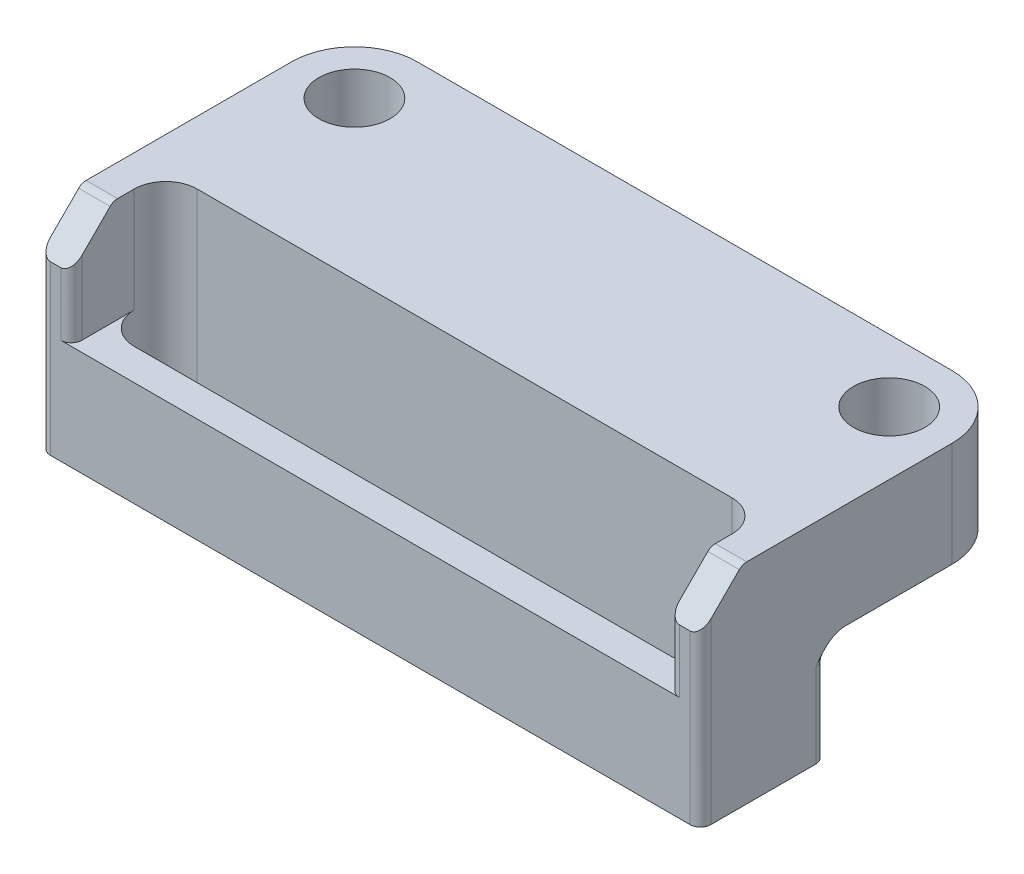
ISO-10303-21;
HEADER;
FILE_DESCRIPTION(('STEP AP214'),'2;1');
FILE_NAME('part.step','',(''),(''),'','','');
FILE_SCHEMA(('AUTOMOTIVE_DESIGN { 1 0 10303 214 1 1 1 1 }'));
ENDSEC;
DATA;
#1=APPLICATION_CONTEXT('core data for automotive mechanical design processes');
#2=APPLICATION_PROTOCOL_DEFINITION('international standard','automotive_design',2000,#1);
#3=PRODUCT_CONTEXT('',#1,'mechanical');
#4=PRODUCT('Part','Part','',(#3));
#5=PRODUCT_RELATED_PRODUCT_CATEGORY('part','',(#4));
#6=PRODUCT_DEFINITION_FORMATION('','',#4);
#7=PRODUCT_DEFINITION_CONTEXT('part definition',#1,'design');
#8=PRODUCT_DEFINITION('design','',#6,#7);
#9=PRODUCT_DEFINITION_SHAPE('','',#8);
#10=(LENGTH_UNIT() NAMED_UNIT(*) SI_UNIT(.MILLI.,.METRE.));
#11=(NAMED_UNIT(*) PLANE_ANGLE_UNIT() SI_UNIT($,.RADIAN.));
#12=(NAMED_UNIT(*) SI_UNIT($,.STERADIAN.) SOLID_ANGLE_UNIT());
#13=UNCERTAINTY_MEASURE_WITH_UNIT(LENGTH_MEASURE(1.E-05),#10,'distance_accuracy_value','');
#14=(GEOMETRIC_REPRESENTATION_CONTEXT(3) GLOBAL_UNCERTAINTY_ASSIGNED_CONTEXT((#13)) GLOBAL_UNIT_ASSIGNED_CONTEXT((#10,
#11,#12)) REPRESENTATION_CONTEXT('',''));
#15=CARTESIAN_POINT('',(0.,0.,0.));
#16=DIRECTION('',(0.,0.,1.));
#17=DIRECTION('',(1.,0.,0.));
#18=AXIS2_PLACEMENT_3D('',#15,#16,#17);
#19=CARTESIAN_POINT('',(0.,5.,12.));
#20=DIRECTION('',(0.,0.,-1.));
#21=DIRECTION('',(-1.,0.,0.));
#22=AXIS2_PLACEMENT_3D('',#19,#20,#21);
#23=PLANE('',#22);
#24=DIRECTION('',(1.,0.,0.));
#25=VECTOR('',#24,1.);
#26=CARTESIAN_POINT('',(0.,-5.,12.));
#27=LINE('',#26,#25);
#28=CARTESIAN_POINT('',(-15.25,-5.,12.));
#29=VERTEX_POINT('',#28);
#30=CARTESIAN_POINT('',(15.25,-5.,12.));
#31=VERTEX_POINT('',#30);
#32=EDGE_CURVE('E335',#29,#31,#27,.T.);
#33=ORIENTED_EDGE('',*,*,#32,.T.);
#34=DIRECTION('',(0.,-1.,0.));
#35=VECTOR('',#34,1.);
#36=CARTESIAN_POINT('',(15.25,2.99999999999999,12.));
#37=LINE('',#36,#35);
#38=CARTESIAN_POINT('',(15.25,2.99999999999999,12.));
#39=VERTEX_POINT('',#38);
#40=EDGE_CURVE('E469',#31,#39,#37,.F.);
#41=ORIENTED_EDGE('',*,*,#40,.T.);
#42=DIRECTION('',(-1.,0.,0.));
#43=VECTOR('',#42,1.);
#44=CARTESIAN_POINT('',(14.25,2.99999999999999,12.));
#45=LINE('',#44,#43);
#46=CARTESIAN_POINT('',(14.75,2.99999999999999,12.));
#47=VERTEX_POINT('',#46);
#48=EDGE_CURVE('E374',#39,#47,#45,.T.);
#49=ORIENTED_EDGE('',*,*,#48,.T.);
#50=DIRECTION('',(0.,1.,0.));
#51=VECTOR('',#50,1.);
#52=CARTESIAN_POINT('',(14.75,0.,12.));
#53=LINE('',#52,#51);
#54=CARTESIAN_POINT('',(14.75,0.,12.));
#55=VERTEX_POINT('',#54);
#56=EDGE_CURVE('E465',#47,#55,#53,.F.);
#57=ORIENTED_EDGE('',*,*,#56,.T.);
#58=DIRECTION('',(1.,0.,0.));
#59=VECTOR('',#58,1.);
#60=CARTESIAN_POINT('',(-14.25,0.,12.));
#61=LINE('',#60,#59);
#62=CARTESIAN_POINT('',(-14.75,0.,12.));
#63=VERTEX_POINT('',#62);
#64=EDGE_CURVE('E688',#63,#55,#61,.T.);
#65=ORIENTED_EDGE('',*,*,#64,.F.);
#66=DIRECTION('',(0.,-1.,0.));
#67=VECTOR('',#66,1.);
#68=CARTESIAN_POINT('',(-14.75,2.99999999999999,12.));
#69=LINE('',#68,#67);
#70=CARTESIAN_POINT('',(-14.75,2.99999999999999,12.));
#71=VERTEX_POINT('',#70);
#72=EDGE_CURVE('E462',#63,#71,#69,.F.);
#73=ORIENTED_EDGE('',*,*,#72,.T.);
#74=DIRECTION('',(-1.,0.,0.));
#75=VECTOR('',#74,1.);
#76=CARTESIAN_POINT('',(-15.75,2.99999999999999,12.));
#77=LINE('',#76,#75);
#78=CARTESIAN_POINT('',(-15.25,2.99999999999999,12.));
#79=VERTEX_POINT('',#78);
#80=EDGE_CURVE('E370',#71,#79,#77,.T.);
#81=ORIENTED_EDGE('',*,*,#80,.T.);
#82=DIRECTION('',(0.,-1.,0.));
#83=VECTOR('',#82,1.);
#84=CARTESIAN_POINT('',(-15.25,5.,12.));
#85=LINE('',#84,#83);
#86=EDGE_CURVE('E458',#79,#29,#85,.T.);
#87=ORIENTED_EDGE('',*,*,#86,.T.);
#88=EDGE_LOOP('',(#33,#41,#49,#57,#65,#73,#81,#87));
#89=FACE_BOUND('',#88,.T.);
#90=ADVANCED_FACE('F50',(#89),#23,.F.);
#91=CARTESIAN_POINT('',(0.,5.,0.));
#92=DIRECTION('',(0.,1.,0.));
#93=DIRECTION('',(0.,0.,1.));
#94=AXIS2_PLACEMENT_3D('',#91,#92,#93);
#95=PLANE('',#94);
#96=CARTESIAN_POINT('',(-12.75,5.,0.));
#97=DIRECTION('',(0.,1.,0.));
#98=DIRECTION('',(0.,0.,1.));
#99=AXIS2_PLACEMENT_3D('',#96,#97,#98);
#100=CIRCLE('',#99,1.69999999999999);
#101=CARTESIAN_POINT('',(-12.75,5.,1.69999999999999));
#102=VERTEX_POINT('',#101);
#103=EDGE_CURVE('E290',#102,#102,#100,.T.);
#104=ORIENTED_EDGE('',*,*,#103,.F.);
#105=EDGE_LOOP('',(#104));
#106=FACE_BOUND('',#105,.T.);
#107=CARTESIAN_POINT('',(12.75,5.,0.));
#108=DIRECTION('',(0.,1.,0.));
#109=DIRECTION('',(0.,0.,1.));
#110=AXIS2_PLACEMENT_3D('',#107,#108,#109);
#111=CIRCLE('',#110,1.69999999999999);
#112=CARTESIAN_POINT('',(12.75,5.,1.69999999999999));
#113=VERTEX_POINT('',#112);
#114=EDGE_CURVE('E306',#113,#113,#111,.T.);
#115=ORIENTED_EDGE('',*,*,#114,.F.);
#116=EDGE_LOOP('',(#115));
#117=FACE_BOUND('',#116,.T.);
#118=DIRECTION('',(0.,0.,-1.));
#119=VECTOR('',#118,1.);
#120=CARTESIAN_POINT('',(14.25,5.,12.));
#121=LINE('',#120,#119);
#122=CARTESIAN_POINT('',(14.25,5.,9.79289321881345));
#123=VERTEX_POINT('',#122);
#124=CARTESIAN_POINT('',(14.25,5.,9.));
#125=VERTEX_POINT('',#124);
#126=EDGE_CURVE('E614',#123,#125,#121,.T.);
#127=ORIENTED_EDGE('',*,*,#126,.F.);
#128=DIRECTION('',(1.,0.,0.));
#129=VECTOR('',#128,1.);
#130=CARTESIAN_POINT('',(0.,5.,9.79289321881345));
#131=LINE('',#130,#129);
#132=CARTESIAN_POINT('',(15.75,5.,9.79289321881345));
#133=VERTEX_POINT('',#132);
#134=EDGE_CURVE('E392',#123,#133,#131,.T.);
#135=ORIENTED_EDGE('',*,*,#134,.T.);
#136=DIRECTION('',(0.,0.,1.));
#137=VECTOR('',#136,1.);
#138=CARTESIAN_POINT('',(15.75,5.,0.));
#139=LINE('',#138,#137);
#140=CARTESIAN_POINT('',(15.75,5.,0.));
#141=VERTEX_POINT('',#140);
#142=EDGE_CURVE('E319',#141,#133,#139,.T.);
#143=ORIENTED_EDGE('',*,*,#142,.F.);
#144=CARTESIAN_POINT('',(12.75,5.,0.));
#145=DIRECTION('',(0.,1.,0.));
#146=DIRECTION('',(0.,0.,1.));
#147=AXIS2_PLACEMENT_3D('',#144,#145,#146);
#148=CIRCLE('',#147,3.);
#149=CARTESIAN_POINT('',(12.75,5.,-3.));
#150=VERTEX_POINT('',#149);
#151=EDGE_CURVE('E323',#150,#141,#148,.F.);
#152=ORIENTED_EDGE('',*,*,#151,.F.);
#153=DIRECTION('',(1.,0.,0.));
#154=VECTOR('',#153,1.);
#155=CARTESIAN_POINT('',(0.,5.,-3.));
#156=LINE('',#155,#154);
#157=CARTESIAN_POINT('',(-12.75,5.,-3.));
#158=VERTEX_POINT('',#157);
#159=EDGE_CURVE('E327',#158,#150,#156,.T.);
#160=ORIENTED_EDGE('',*,*,#159,.F.);
#161=CARTESIAN_POINT('',(-12.75,5.,0.));
#162=DIRECTION('',(0.,1.,0.));
#163=DIRECTION('',(0.,0.,1.));
#164=AXIS2_PLACEMENT_3D('',#161,#162,#163);
#165=CIRCLE('',#164,3.);
#166=CARTESIAN_POINT('',(-15.75,5.,0.));
#167=VERTEX_POINT('',#166);
#168=EDGE_CURVE('E311',#158,#167,#165,.T.);
#169=ORIENTED_EDGE('',*,*,#168,.T.);
#170=DIRECTION('',(0.,0.,1.));
#171=VECTOR('',#170,1.);
#172=CARTESIAN_POINT('',(-15.75,5.,0.));
#173=LINE('',#172,#171);
#174=CARTESIAN_POINT('',(-15.75,5.,9.79289321881345));
#175=VERTEX_POINT('',#174);
#176=EDGE_CURVE('E315',#167,#175,#173,.T.);
#177=ORIENTED_EDGE('',*,*,#176,.T.);
#178=DIRECTION('',(1.,0.,0.));
#179=VECTOR('',#178,1.);
#180=CARTESIAN_POINT('',(0.,5.,9.79289321881345));
#181=LINE('',#180,#179);
#182=CARTESIAN_POINT('',(-14.25,5.,9.79289321881345));
#183=VERTEX_POINT('',#182);
#184=EDGE_CURVE('E250',#175,#183,#181,.T.);
#185=ORIENTED_EDGE('',*,*,#184,.T.);
#186=DIRECTION('',(0.,0.,-1.));
#187=VECTOR('',#186,1.);
#188=CARTESIAN_POINT('',(-14.25,5.,12.));
#189=LINE('',#188,#187);
#190=CARTESIAN_POINT('',(-14.25,5.,9.));
#191=VERTEX_POINT('',#190);
#192=EDGE_CURVE('E241',#183,#191,#189,.T.);
#193=ORIENTED_EDGE('',*,*,#192,.T.);
#194=CARTESIAN_POINT('',(-12.75,5.,9.));
#195=DIRECTION('',(0.,1.,0.));
#196=DIRECTION('',(0.,0.,1.));
#197=AXIS2_PLACEMENT_3D('',#194,#195,#196);
#198=CIRCLE('',#197,1.5);
#199=CARTESIAN_POINT('',(-12.75,5.,7.5));
#200=VERTEX_POINT('',#199);
#201=EDGE_CURVE('E247',#200,#191,#198,.T.);
#202=ORIENTED_EDGE('',*,*,#201,.F.);
#203=DIRECTION('',(-1.,0.,0.));
#204=VECTOR('',#203,1.);
#205=CARTESIAN_POINT('',(-12.75,5.,7.5));
#206=LINE('',#205,#204);
#207=CARTESIAN_POINT('',(12.75,5.,7.5));
#208=VERTEX_POINT('',#207);
#209=EDGE_CURVE('E277',#208,#200,#206,.T.);
#210=ORIENTED_EDGE('',*,*,#209,.F.);
#211=CARTESIAN_POINT('',(12.75,5.,9.));
#212=DIRECTION('',(0.,1.,0.));
#213=DIRECTION('',(0.,0.,1.));
#214=AXIS2_PLACEMENT_3D('',#211,#212,#213);
#215=CIRCLE('',#214,1.5);
#216=EDGE_CURVE('E272',#125,#208,#215,.T.);
#217=ORIENTED_EDGE('',*,*,#216,.F.);
#218=EDGE_LOOP('',(#127,#135,#143,#152,#160,#169,#177,#185,#193,#202,#210,#217));
#219=FACE_BOUND('',#218,.T.);
#220=ADVANCED_FACE('F244',(#106,#117,#219),#95,.T.);
#221=CARTESIAN_POINT('',(-12.75,-5.,9.));
#222=DIRECTION('',(0.,1.,0.));
#223=DIRECTION('',(0.,0.,1.));
#224=AXIS2_PLACEMENT_3D('',#221,#222,#223);
#225=CYLINDRICAL_SURFACE('',#224,1.5);
#226=CARTESIAN_POINT('',(-12.75,0.,9.));
#227=DIRECTION('',(0.,1.,0.));
#228=DIRECTION('',(0.,0.,1.));
#229=AXIS2_PLACEMENT_3D('',#226,#227,#228);
#230=CIRCLE('',#229,1.5);
#231=CARTESIAN_POINT('',(-12.75,0.,10.5));
#232=VERTEX_POINT('',#231);
#233=CARTESIAN_POINT('',(-14.25,0.,9.));
#234=VERTEX_POINT('',#233);
#235=EDGE_CURVE('E640',#232,#234,#230,.F.);
#236=ORIENTED_EDGE('',*,*,#235,.F.);
#237=DIRECTION('',(0.,1.,0.));
#238=VECTOR('',#237,1.);
#239=CARTESIAN_POINT('',(-12.75,-5.,10.5));
#240=LINE('',#239,#238);
#241=CARTESIAN_POINT('',(-12.75,-5.,10.5));
#242=VERTEX_POINT('',#241);
#243=EDGE_CURVE('E299',#242,#232,#240,.T.);
#244=ORIENTED_EDGE('',*,*,#243,.F.);
#245=CARTESIAN_POINT('',(-12.75,-5.,9.));
#246=DIRECTION('',(0.,1.,0.));
#247=DIRECTION('',(0.,0.,1.));
#248=AXIS2_PLACEMENT_3D('',#245,#246,#247);
#249=CIRCLE('',#248,1.5);
#250=CARTESIAN_POINT('',(-12.75,-5.,7.5));
#251=VERTEX_POINT('',#250);
#252=EDGE_CURVE('E287',#251,#242,#249,.T.);
#253=ORIENTED_EDGE('',*,*,#252,.F.);
#254=DIRECTION('',(0.,1.,0.));
#255=VECTOR('',#254,1.);
#256=CARTESIAN_POINT('',(-12.75,-5.,7.5));
#257=LINE('',#256,#255);
#258=EDGE_CURVE('E269',#251,#200,#257,.T.);
#259=ORIENTED_EDGE('',*,*,#258,.T.);
#260=ORIENTED_EDGE('',*,*,#201,.T.);
#261=DIRECTION('',(0.,-1.,0.));
#262=VECTOR('',#261,1.);
#263=CARTESIAN_POINT('',(-14.25,5.,9.));
#264=LINE('',#263,#262);
#265=EDGE_CURVE('E257',#191,#234,#264,.T.);
#266=ORIENTED_EDGE('',*,*,#265,.T.);
#267=EDGE_LOOP('',(#236,#244,#253,#259,#260,#266));
#268=FACE_BOUND('',#267,.T.);
#269=ADVANCED_FACE('F267',(#268),#225,.F.);
#270=CARTESIAN_POINT('',(12.75,-5.,9.));
#271=DIRECTION('',(0.,1.,0.));
#272=DIRECTION('',(0.,0.,1.));
#273=AXIS2_PLACEMENT_3D('',#270,#271,#272);
#274=CYLINDRICAL_SURFACE('',#273,1.5);
#275=CARTESIAN_POINT('',(12.75,0.,9.));
#276=DIRECTION('',(0.,1.,0.));
#277=DIRECTION('',(0.,0.,1.));
#278=AXIS2_PLACEMENT_3D('',#275,#276,#277);
#279=CIRCLE('',#278,1.5);
#280=CARTESIAN_POINT('',(14.25,0.,9.));
#281=VERTEX_POINT('',#280);
#282=CARTESIAN_POINT('',(12.75,0.,10.5));
#283=VERTEX_POINT('',#282);
#284=EDGE_CURVE('E253',#281,#283,#279,.F.);
#285=ORIENTED_EDGE('',*,*,#284,.F.);
#286=DIRECTION('',(0.,1.,0.));
#287=VECTOR('',#286,1.);
#288=CARTESIAN_POINT('',(14.25,5.,9.));
#289=LINE('',#288,#287);
#290=EDGE_CURVE('E265',#281,#125,#289,.T.);
#291=ORIENTED_EDGE('',*,*,#290,.T.);
#292=ORIENTED_EDGE('',*,*,#216,.T.);
#293=DIRECTION('',(0.,1.,0.));
#294=VECTOR('',#293,1.);
#295=CARTESIAN_POINT('',(12.75,-5.,7.5));
#296=LINE('',#295,#294);
#297=CARTESIAN_POINT('',(12.75,-5.,7.5));
#298=VERTEX_POINT('',#297);
#299=EDGE_CURVE('E291',#298,#208,#296,.T.);
#300=ORIENTED_EDGE('',*,*,#299,.F.);
#301=CARTESIAN_POINT('',(12.75,-5.,9.));
#302=DIRECTION('',(0.,1.,0.));
#303=DIRECTION('',(0.,0.,1.));
#304=AXIS2_PLACEMENT_3D('',#301,#302,#303);
#305=CIRCLE('',#304,1.5);
#306=CARTESIAN_POINT('',(12.75,-5.,10.5));
#307=VERTEX_POINT('',#306);
#308=EDGE_CURVE('E674',#307,#298,#305,.T.);
#309=ORIENTED_EDGE('',*,*,#308,.F.);
#310=DIRECTION('',(0.,1.,0.));
#311=VECTOR('',#310,1.);
#312=CARTESIAN_POINT('',(12.75,-5.,10.5));
#313=LINE('',#312,#311);
#314=EDGE_CURVE('E295',#307,#283,#313,.T.);
#315=ORIENTED_EDGE('',*,*,#314,.T.);
#316=EDGE_LOOP('',(#285,#291,#292,#300,#309,#315));
#317=FACE_BOUND('',#316,.T.);
#318=ADVANCED_FACE('F568',(#317),#274,.F.);
#319=CARTESIAN_POINT('',(-12.75,-5.,10.5));
#320=DIRECTION('',(0.,0.,1.));
#321=DIRECTION('',(1.,0.,0.));
#322=AXIS2_PLACEMENT_3D('',#319,#320,#321);
#323=PLANE('',#322);
#324=DIRECTION('',(-1.,0.,0.));
#325=VECTOR('',#324,1.);
#326=CARTESIAN_POINT('',(-12.75,0.,10.5));
#327=LINE('',#326,#325);
#328=EDGE_CURVE('E357',#283,#232,#327,.T.);
#329=ORIENTED_EDGE('',*,*,#328,.F.);
#330=ORIENTED_EDGE('',*,*,#314,.F.);
#331=DIRECTION('',(1.,0.,0.));
#332=VECTOR('',#331,1.);
#333=CARTESIAN_POINT('',(-12.75,-5.,10.5));
#334=LINE('',#333,#332);
#335=EDGE_CURVE('E671',#242,#307,#334,.T.);
#336=ORIENTED_EDGE('',*,*,#335,.F.);
#337=ORIENTED_EDGE('',*,*,#243,.T.);
#338=EDGE_LOOP('',(#329,#330,#336,#337));
#339=FACE_BOUND('',#338,.T.);
#340=ADVANCED_FACE('F569',(#339),#323,.F.);
#341=CARTESIAN_POINT('',(-12.75,5.,0.));
#342=DIRECTION('',(0.,-1.,0.));
#343=DIRECTION('',(0.,0.,-1.));
#344=AXIS2_PLACEMENT_3D('',#341,#342,#343);
#345=CYLINDRICAL_SURFACE('',#344,3.);
#346=CARTESIAN_POINT('',(-12.75,0.,0.));
#347=DIRECTION('',(0.,-1.,0.));
#348=DIRECTION('',(0.,0.,-1.));
#349=AXIS2_PLACEMENT_3D('',#346,#347,#348);
#350=CIRCLE('',#349,3.);
#351=CARTESIAN_POINT('',(-15.75,0.,0.));
#352=VERTEX_POINT('',#351);
#353=CARTESIAN_POINT('',(-12.75,0.,-3.));
#354=VERTEX_POINT('',#353);
#355=EDGE_CURVE('E273',#352,#354,#350,.T.);
#356=ORIENTED_EDGE('',*,*,#355,.F.);
#357=DIRECTION('',(0.,-1.,0.));
#358=VECTOR('',#357,1.);
#359=CARTESIAN_POINT('',(-15.75,5.,0.));
#360=LINE('',#359,#358);
#361=EDGE_CURVE('E353',#167,#352,#360,.T.);
#362=ORIENTED_EDGE('',*,*,#361,.F.);
#363=ORIENTED_EDGE('',*,*,#168,.F.);
#364=DIRECTION('',(0.,-1.,0.));
#365=VECTOR('',#364,1.);
#366=CARTESIAN_POINT('',(-12.75,5.,-3.));
#367=LINE('',#366,#365);
#368=EDGE_CURVE('E331',#158,#354,#367,.T.);
#369=ORIENTED_EDGE('',*,*,#368,.T.);
#370=EDGE_LOOP('',(#356,#362,#363,#369));
#371=FACE_BOUND('',#370,.T.);
#372=ADVANCED_FACE('F572',(#371),#345,.T.);
#373=CARTESIAN_POINT('',(-15.75,5.,0.));
#374=DIRECTION('',(1.,0.,0.));
#375=DIRECTION('',(0.,0.,-1.));
#376=AXIS2_PLACEMENT_3D('',#373,#374,#375);
#377=PLANE('',#376);
#378=DIRECTION('',(0.,0.707106781186549,-0.707106781186546));
#379=VECTOR('',#378,1.);
#380=CARTESIAN_POINT('',(-15.75,5.,10.));
#381=LINE('',#380,#379);
#382=CARTESIAN_POINT('',(-15.75,3.5,11.5));
#383=VERTEX_POINT('',#382);
#384=CARTESIAN_POINT('',(-15.75,4.85355339059327,10.1464466094067));
#385=VERTEX_POINT('',#384);
#386=EDGE_CURVE('E386',#383,#385,#381,.T.);
#387=ORIENTED_EDGE('',*,*,#386,.T.);
#388=CARTESIAN_POINT('',(-15.75,4.5,9.79289321881345));
#389=DIRECTION('',(1.,0.,0.));
#390=DIRECTION('',(0.,0.,-1.));
#391=AXIS2_PLACEMENT_3D('',#388,#389,#390);
#392=CIRCLE('',#391,0.5);
#393=EDGE_CURVE('E443',#385,#175,#392,.F.);
#394=ORIENTED_EDGE('',*,*,#393,.T.);
#395=ORIENTED_EDGE('',*,*,#176,.F.);
#396=ORIENTED_EDGE('',*,*,#361,.T.);
#397=DIRECTION('',(0.,0.,-1.));
#398=VECTOR('',#397,1.);
#399=CARTESIAN_POINT('',(-15.75,0.,0.));
#400=LINE('',#399,#398);
#401=CARTESIAN_POINT('',(-15.75,0.,5.0857864376269));
#402=VERTEX_POINT('',#401);
#403=EDGE_CURVE('E652',#402,#352,#400,.T.);
#404=ORIENTED_EDGE('',*,*,#403,.F.);
#405=CARTESIAN_POINT('',(-15.75,0.,5.0857864376269));
#406=CARTESIAN_POINT('',(-15.75,1.17606470882716E-06,5.11770704351345));
#407=CARTESIAN_POINT('',(-15.75,-0.00135915049070655,5.14960955788945));
#408=CARTESIAN_POINT('',(-15.75,-0.0067170930110145,5.21317336397046));
#409=CARTESIAN_POINT('',(-15.75,-0.0107130725141404,5.24483479303281));
#410=CARTESIAN_POINT('',(-15.75,-0.0264666508758119,5.33883961722622));
#411=CARTESIAN_POINT('',(-15.75,-0.041992046660591,5.40058324140448));
#412=CARTESIAN_POINT('',(-15.75,-0.0830237895262632,5.52376467425136));
#413=CARTESIAN_POINT('',(-15.75,-0.10895721730549,5.58505719923193));
#414=CARTESIAN_POINT('',(-15.75,-0.169324910092162,5.7033460626132));
#415=CARTESIAN_POINT('',(-15.75,-0.203768898228859,5.76033738908347));
#416=CARTESIAN_POINT('',(-15.75,-0.272801502563368,5.8597688611239));
#417=CARTESIAN_POINT('',(-15.75,-0.306277743847892,5.90299556782718));
#418=CARTESIAN_POINT('',(-15.75,-0.377017095811636,5.9862518869615));
#419=CARTESIAN_POINT('',(-15.75,-0.414282503889079,6.026279533198));
#420=CARTESIAN_POINT('',(-15.75,-0.530587493834939,6.14201288362221));
#421=CARTESIAN_POINT('',(-15.75,-0.614043096166536,6.21324343570576));
#422=CARTESIAN_POINT('',(-15.75,-0.748180963777102,6.31819129176676));
#423=CARTESIAN_POINT('',(-15.75,-0.796962387574724,6.35452230982181));
#424=CARTESIAN_POINT('',(-15.75,-0.895437276732214,6.42602755417568));
#425=CARTESIAN_POINT('',(-15.75,-0.945131417235427,6.46120086560432));
#426=CARTESIAN_POINT('',(-15.75,-0.996557352982855,6.49756568420489));
#427=CARTESIAN_POINT('',(-15.75,-0.998278679077714,6.4987828457212));
#428=CARTESIAN_POINT('',(-15.75,-1.,6.5));
#429=B_SPLINE_CURVE_WITH_KNOTS('',3,(#405,#406,#407,#408,#409,#410,#411,#412,#413,#414,#415,
#416,#417,#418,#419,#420,#421,#422,#423,#424,#425,#426,#427,#428),.UNSPECIFIED.,.F.,.F.,(4,2,2,
2,2,2,2,2,2,2,2,4),(0.,0.0957001521564504,0.191340940502904,0.381497140291659,0.580418508214723,
0.779568198888442,0.943344642161563,1.10722098313676,1.43543617003116,1.61792302379494,
1.80055078362661,1.80687533894615),.UNSPECIFIED.);
#430=CARTESIAN_POINT('',(-15.75,-1.,6.5));
#431=VERTEX_POINT('',#430);
#432=EDGE_CURVE('E61',#402,#431,#429,.T.);
#433=ORIENTED_EDGE('',*,*,#432,.T.);
#434=DIRECTION('',(0.,1.,0.));
#435=VECTOR('',#434,1.);
#436=CARTESIAN_POINT('',(-15.75,-5.,6.5));
#437=LINE('',#436,#435);
#438=CARTESIAN_POINT('',(-15.75,-5.,6.5));
#439=VERTEX_POINT('',#438);
#440=EDGE_CURVE('E437',#431,#439,#437,.F.);
#441=ORIENTED_EDGE('',*,*,#440,.T.);
#442=DIRECTION('',(0.,0.,1.));
#443=VECTOR('',#442,1.);
#444=CARTESIAN_POINT('',(-15.75,-5.,0.));
#445=LINE('',#444,#443);
#446=CARTESIAN_POINT('',(-15.75,-5.,11.5));
#447=VERTEX_POINT('',#446);
#448=EDGE_CURVE('E310',#439,#447,#445,.T.);
#449=ORIENTED_EDGE('',*,*,#448,.T.);
#450=DIRECTION('',(0.,-1.,0.));
#451=VECTOR('',#450,1.);
#452=CARTESIAN_POINT('',(-15.75,5.,11.5));
#453=LINE('',#452,#451);
#454=EDGE_CURVE('E440',#447,#383,#453,.F.);
#455=ORIENTED_EDGE('',*,*,#454,.T.);
#456=EDGE_LOOP('',(#387,#394,#395,#396,#404,#433,#441,#449,#455));
#457=FACE_BOUND('',#456,.T.);
#458=ADVANCED_FACE('F514',(#457),#377,.F.);
#459=CARTESIAN_POINT('',(15.75,5.,0.));
#460=DIRECTION('',(1.,0.,0.));
#461=DIRECTION('',(0.,0.,-1.));
#462=AXIS2_PLACEMENT_3D('',#459,#460,#461);
#463=PLANE('',#462);
#464=ORIENTED_EDGE('',*,*,#142,.T.);
#465=CARTESIAN_POINT('',(15.75,4.5,9.79289321881345));
#466=DIRECTION('',(1.,0.,0.));
#467=DIRECTION('',(0.,0.,-1.));
#468=AXIS2_PLACEMENT_3D('',#465,#466,#467);
#469=CIRCLE('',#468,0.5);
#470=CARTESIAN_POINT('',(15.75,4.85355339059327,10.1464466094067));
#471=VERTEX_POINT('',#470);
#472=EDGE_CURVE('E403',#133,#471,#469,.T.);
#473=ORIENTED_EDGE('',*,*,#472,.T.);
#474=DIRECTION('',(0.,-0.707106781186549,0.707106781186546));
#475=VECTOR('',#474,1.);
#476=CARTESIAN_POINT('',(15.75,10.,5.00000000000002));
#477=LINE('',#476,#475);
#478=CARTESIAN_POINT('',(15.75,3.5,11.5));
#479=VERTEX_POINT('',#478);
#480=EDGE_CURVE('E366',#471,#479,#477,.T.);
#481=ORIENTED_EDGE('',*,*,#480,.T.);
#482=DIRECTION('',(0.,-1.,0.));
#483=VECTOR('',#482,1.);
#484=CARTESIAN_POINT('',(15.75,-5.,11.5));
#485=LINE('',#484,#483);
#486=CARTESIAN_POINT('',(15.75,-5.,11.5));
#487=VERTEX_POINT('',#486);
#488=EDGE_CURVE('E399',#479,#487,#485,.T.);
#489=ORIENTED_EDGE('',*,*,#488,.T.);
#490=DIRECTION('',(0.,0.,1.));
#491=VECTOR('',#490,1.);
#492=CARTESIAN_POINT('',(15.75,-5.,0.));
#493=LINE('',#492,#491);
#494=CARTESIAN_POINT('',(15.75,-5.,6.5));
#495=VERTEX_POINT('',#494);
#496=EDGE_CURVE('E316',#495,#487,#493,.T.);
#497=ORIENTED_EDGE('',*,*,#496,.F.);
#498=DIRECTION('',(0.,1.,0.));
#499=VECTOR('',#498,1.);
#500=CARTESIAN_POINT('',(15.75,5.,6.5));
#501=LINE('',#500,#499);
#502=CARTESIAN_POINT('',(15.75,-1.,6.5));
#503=VERTEX_POINT('',#502);
#504=EDGE_CURVE('E396',#495,#503,#501,.T.);
#505=ORIENTED_EDGE('',*,*,#504,.T.);
#506=CARTESIAN_POINT('',(15.75,0.,5.0857864376269));
#507=CARTESIAN_POINT('',(15.75,1.17606470882716E-06,5.11770704351345));
#508=CARTESIAN_POINT('',(15.75,-0.00135915049070655,5.14960955788945));
#509=CARTESIAN_POINT('',(15.75,-0.0067170930110145,5.21317336397046));
#510=CARTESIAN_POINT('',(15.75,-0.0107130725141404,5.24483479303281));
#511=CARTESIAN_POINT('',(15.75,-0.0264666508758119,5.33883961722622));
#512=CARTESIAN_POINT('',(15.75,-0.041992046660591,5.40058324140448));
#513=CARTESIAN_POINT('',(15.75,-0.0830237895262632,5.52376467425136));
#514=CARTESIAN_POINT('',(15.75,-0.10895721730549,5.58505719923193));
#515=CARTESIAN_POINT('',(15.75,-0.169324910092162,5.7033460626132));
#516=CARTESIAN_POINT('',(15.75,-0.203768898228859,5.76033738908347));
#517=CARTESIAN_POINT('',(15.75,-0.272801502563368,5.8597688611239));
#518=CARTESIAN_POINT('',(15.75,-0.306277743847892,5.90299556782718));
#519=CARTESIAN_POINT('',(15.75,-0.377017095811636,5.9862518869615));
#520=CARTESIAN_POINT('',(15.75,-0.414282503889079,6.026279533198));
#521=CARTESIAN_POINT('',(15.75,-0.530587493834939,6.14201288362221));
#522=CARTESIAN_POINT('',(15.75,-0.614043096166536,6.21324343570576));
#523=CARTESIAN_POINT('',(15.75,-0.748180963777102,6.31819129176676));
#524=CARTESIAN_POINT('',(15.75,-0.796962387574724,6.35452230982181));
#525=CARTESIAN_POINT('',(15.75,-0.895437276732214,6.42602755417568));
#526=CARTESIAN_POINT('',(15.75,-0.945131417235427,6.46120086560432));
#527=CARTESIAN_POINT('',(15.75,-0.996557352982855,6.49756568420489));
#528=CARTESIAN_POINT('',(15.75,-0.998278679077714,6.4987828457212));
#529=CARTESIAN_POINT('',(15.75,-1.,6.5));
#530=B_SPLINE_CURVE_WITH_KNOTS('',3,(#506,#507,#508,#509,#510,#511,#512,#513,#514,#515,#516,
#517,#518,#519,#520,#521,#522,#523,#524,#525,#526,#527,#528,#529),.UNSPECIFIED.,.F.,.F.,(4,2,2,
2,2,2,2,2,2,2,2,4),(0.,0.0957001521564504,0.191340940502904,0.381497140291659,0.580418508214723,
0.779568198888442,0.943344642161563,1.10722098313676,1.43543617003116,1.61792302379494,
1.80055078362661,1.80687533894615),.UNSPECIFIED.);
#531=CARTESIAN_POINT('',(15.75,0.,5.0857864376269));
#532=VERTEX_POINT('',#531);
#533=EDGE_CURVE('E12',#503,#532,#530,.F.);
#534=ORIENTED_EDGE('',*,*,#533,.T.);
#535=DIRECTION('',(0.,0.,-1.));
#536=VECTOR('',#535,1.);
#537=CARTESIAN_POINT('',(15.75,0.,0.));
#538=LINE('',#537,#536);
#539=CARTESIAN_POINT('',(15.75,0.,0.));
#540=VERTEX_POINT('',#539);
#541=EDGE_CURVE('E617',#532,#540,#538,.T.);
#542=ORIENTED_EDGE('',*,*,#541,.T.);
#543=DIRECTION('',(0.,-1.,0.));
#544=VECTOR('',#543,1.);
#545=CARTESIAN_POINT('',(15.75,5.,0.));
#546=LINE('',#545,#544);
#547=EDGE_CURVE('E349',#141,#540,#546,.T.);
#548=ORIENTED_EDGE('',*,*,#547,.F.);
#549=EDGE_LOOP('',(#464,#473,#481,#489,#497,#505,#534,#542,#548));
#550=FACE_BOUND('',#549,.T.);
#551=ADVANCED_FACE('F540',(#550),#463,.T.);
#552=CARTESIAN_POINT('',(12.75,5.,0.));
#553=DIRECTION('',(0.,-1.,0.));
#554=DIRECTION('',(0.,0.,-1.));
#555=AXIS2_PLACEMENT_3D('',#552,#553,#554);
#556=CYLINDRICAL_SURFACE('',#555,3.);
#557=ORIENTED_EDGE('',*,*,#547,.T.);
#558=CARTESIAN_POINT('',(12.75,0.,0.));
#559=DIRECTION('',(0.,-1.,0.));
#560=DIRECTION('',(0.,0.,-1.));
#561=AXIS2_PLACEMENT_3D('',#558,#559,#560);
#562=CIRCLE('',#561,3.);
#563=CARTESIAN_POINT('',(12.75,0.,-3.));
#564=VERTEX_POINT('',#563);
#565=EDGE_CURVE('E279',#540,#564,#562,.F.);
#566=ORIENTED_EDGE('',*,*,#565,.T.);
#567=DIRECTION('',(0.,-1.,0.));
#568=VECTOR('',#567,1.);
#569=CARTESIAN_POINT('',(12.75,5.,-3.));
#570=LINE('',#569,#568);
#571=EDGE_CURVE('E345',#150,#564,#570,.T.);
#572=ORIENTED_EDGE('',*,*,#571,.F.);
#573=ORIENTED_EDGE('',*,*,#151,.T.);
#574=EDGE_LOOP('',(#557,#566,#572,#573));
#575=FACE_BOUND('',#574,.T.);
#576=ADVANCED_FACE('F544',(#575),#556,.T.);
#577=CARTESIAN_POINT('',(0.,5.,-3.));
#578=DIRECTION('',(0.,0.,-1.));
#579=DIRECTION('',(-1.,0.,0.));
#580=AXIS2_PLACEMENT_3D('',#577,#578,#579);
#581=PLANE('',#580);
#582=ORIENTED_EDGE('',*,*,#571,.T.);
#583=DIRECTION('',(1.,0.,0.));
#584=VECTOR('',#583,1.);
#585=CARTESIAN_POINT('',(-15.75,0.,-3.));
#586=LINE('',#585,#584);
#587=EDGE_CURVE('E363',#354,#564,#586,.T.);
#588=ORIENTED_EDGE('',*,*,#587,.F.);
#589=ORIENTED_EDGE('',*,*,#368,.F.);
#590=ORIENTED_EDGE('',*,*,#159,.T.);
#591=EDGE_LOOP('',(#582,#588,#589,#590));
#592=FACE_BOUND('',#591,.T.);
#593=ADVANCED_FACE('F548',(#592),#581,.T.);
#594=CARTESIAN_POINT('',(0.,-5.,0.));
#595=DIRECTION('',(0.,1.,0.));
#596=DIRECTION('',(0.,0.,1.));
#597=AXIS2_PLACEMENT_3D('',#594,#595,#596);
#598=PLANE('',#597);
#599=DIRECTION('',(-1.,0.,0.));
#600=VECTOR('',#599,1.);
#601=CARTESIAN_POINT('',(-12.75,-5.,7.5));
#602=LINE('',#601,#600);
#603=EDGE_CURVE('E282',#298,#251,#602,.T.);
#604=ORIENTED_EDGE('',*,*,#603,.T.);
#605=ORIENTED_EDGE('',*,*,#252,.T.);
#606=ORIENTED_EDGE('',*,*,#335,.T.);
#607=ORIENTED_EDGE('',*,*,#308,.T.);
#608=EDGE_LOOP('',(#604,#605,#606,#607));
#609=FACE_BOUND('',#608,.T.);
#610=ORIENTED_EDGE('',*,*,#496,.T.);
#611=CARTESIAN_POINT('',(15.25,-5.,11.5));
#612=DIRECTION('',(0.,1.,0.));
#613=DIRECTION('',(0.,0.,1.));
#614=AXIS2_PLACEMENT_3D('',#611,#612,#613);
#615=CIRCLE('',#614,0.5);
#616=EDGE_CURVE('E455',#487,#31,#615,.F.);
#617=ORIENTED_EDGE('',*,*,#616,.T.);
#618=ORIENTED_EDGE('',*,*,#32,.F.);
#619=CARTESIAN_POINT('',(-15.25,-5.,11.5));
#620=DIRECTION('',(0.,1.,0.));
#621=DIRECTION('',(0.,0.,1.));
#622=AXIS2_PLACEMENT_3D('',#619,#620,#621);
#623=CIRCLE('',#622,0.5);
#624=EDGE_CURVE('E452',#29,#447,#623,.F.);
#625=ORIENTED_EDGE('',*,*,#624,.T.);
#626=ORIENTED_EDGE('',*,*,#448,.F.);
#627=CARTESIAN_POINT('',(-15.25,-5.,6.5));
#628=DIRECTION('',(0.,1.,0.));
#629=DIRECTION('',(0.,0.,1.));
#630=AXIS2_PLACEMENT_3D('',#627,#628,#629);
#631=CIRCLE('',#630,0.5);
#632=CARTESIAN_POINT('',(-15.25,-5.,6.));
#633=VERTEX_POINT('',#632);
#634=EDGE_CURVE('E449',#439,#633,#631,.F.);
#635=ORIENTED_EDGE('',*,*,#634,.T.);
#636=DIRECTION('',(1.,0.,0.));
#637=VECTOR('',#636,1.);
#638=CARTESIAN_POINT('',(-15.75,-5.,6.));
#639=LINE('',#638,#637);
#640=CARTESIAN_POINT('',(15.25,-5.,6.));
#641=VERTEX_POINT('',#640);
#642=EDGE_CURVE('E655',#633,#641,#639,.T.);
#643=ORIENTED_EDGE('',*,*,#642,.T.);
#644=CARTESIAN_POINT('',(15.25,-5.,6.5));
#645=DIRECTION('',(0.,1.,0.));
#646=DIRECTION('',(0.,0.,1.));
#647=AXIS2_PLACEMENT_3D('',#644,#645,#646);
#648=CIRCLE('',#647,0.5);
#649=EDGE_CURVE('E446',#641,#495,#648,.F.);
#650=ORIENTED_EDGE('',*,*,#649,.T.);
#651=EDGE_LOOP('',(#610,#617,#618,#625,#626,#635,#643,#650));
#652=FACE_BOUND('',#651,.T.);
#653=ADVANCED_FACE('F552',(#609,#652),#598,.F.);
#654=CARTESIAN_POINT('',(12.75,5.,0.));
#655=DIRECTION('',(0.,1.,0.));
#656=DIRECTION('',(0.,0.,1.));
#657=AXIS2_PLACEMENT_3D('',#654,#655,#656);
#658=CYLINDRICAL_SURFACE('',#657,1.69999999999999);
#659=ORIENTED_EDGE('',*,*,#114,.T.);
#660=EDGE_LOOP('',(#659));
#661=FACE_BOUND('',#660,.T.);
#662=CARTESIAN_POINT('',(12.75,0.,0.));
#663=DIRECTION('',(0.,-1.,0.));
#664=DIRECTION('',(0.,0.,-1.));
#665=AXIS2_PLACEMENT_3D('',#662,#663,#664);
#666=CIRCLE('',#665,1.69999999999999);
#667=CARTESIAN_POINT('',(12.75,0.,-1.69999999999999));
#668=VERTEX_POINT('',#667);
#669=EDGE_CURVE('E362',#668,#668,#666,.F.);
#670=ORIENTED_EDGE('',*,*,#669,.F.);
#671=EDGE_LOOP('',(#670));
#672=FACE_BOUND('',#671,.T.);
#673=ADVANCED_FACE('F555',(#661,#672),#658,.F.);
#674=CARTESIAN_POINT('',(-12.75,5.,0.));
#675=DIRECTION('',(0.,1.,0.));
#676=DIRECTION('',(0.,0.,1.));
#677=AXIS2_PLACEMENT_3D('',#674,#675,#676);
#678=CYLINDRICAL_SURFACE('',#677,1.69999999999999);
#679=ORIENTED_EDGE('',*,*,#103,.T.);
#680=EDGE_LOOP('',(#679));
#681=FACE_BOUND('',#680,.T.);
#682=CARTESIAN_POINT('',(-12.75,0.,0.));
#683=DIRECTION('',(0.,-1.,0.));
#684=DIRECTION('',(0.,0.,-1.));
#685=AXIS2_PLACEMENT_3D('',#682,#683,#684);
#686=CIRCLE('',#685,1.69999999999999);
#687=CARTESIAN_POINT('',(-12.75,0.,-1.69999999999999));
#688=VERTEX_POINT('',#687);
#689=EDGE_CURVE('E358',#688,#688,#686,.F.);
#690=ORIENTED_EDGE('',*,*,#689,.F.);
#691=EDGE_LOOP('',(#690));
#692=FACE_BOUND('',#691,.T.);
#693=ADVANCED_FACE('F560',(#681,#692),#678,.F.);
#694=CARTESIAN_POINT('',(-12.75,-5.,7.5));
#695=DIRECTION('',(0.,0.,-1.));
#696=DIRECTION('',(-1.,0.,0.));
#697=AXIS2_PLACEMENT_3D('',#694,#695,#696);
#698=PLANE('',#697);
#699=ORIENTED_EDGE('',*,*,#209,.T.);
#700=ORIENTED_EDGE('',*,*,#258,.F.);
#701=ORIENTED_EDGE('',*,*,#603,.F.);
#702=ORIENTED_EDGE('',*,*,#299,.T.);
#703=EDGE_LOOP('',(#699,#700,#701,#702));
#704=FACE_BOUND('',#703,.T.);
#705=ADVANCED_FACE('F564',(#704),#698,.F.);
#706=CARTESIAN_POINT('',(-15.75,0.,0.));
#707=DIRECTION('',(0.,-1.,0.));
#708=DIRECTION('',(0.,0.,-1.));
#709=AXIS2_PLACEMENT_3D('',#706,#707,#708);
#710=PLANE('',#709);
#711=ORIENTED_EDGE('',*,*,#669,.T.);
#712=EDGE_LOOP('',(#711));
#713=FACE_BOUND('',#712,.T.);
#714=ORIENTED_EDGE('',*,*,#689,.T.);
#715=EDGE_LOOP('',(#714));
#716=FACE_BOUND('',#715,.T.);
#717=DIRECTION('',(1.,0.,0.));
#718=VECTOR('',#717,1.);
#719=CARTESIAN_POINT('',(-15.25,0.,5.));
#720=LINE('',#719,#718);
#721=CARTESIAN_POINT('',(15.25,0.,5.));
#722=VERTEX_POINT('',#721);
#723=CARTESIAN_POINT('',(-15.25,0.,5.));
#724=VERTEX_POINT('',#723);
#725=EDGE_CURVE('E485',#722,#724,#720,.F.);
#726=ORIENTED_EDGE('',*,*,#725,.T.);
#727=CARTESIAN_POINT('',(-15.25,0.,6.5));
#728=DIRECTION('',(0.,-1.,0.));
#729=DIRECTION('',(0.,0.,-1.));
#730=AXIS2_PLACEMENT_3D('',#727,#728,#729);
#731=CIRCLE('',#730,1.5);
#732=EDGE_CURVE('E491',#724,#402,#731,.F.);
#733=ORIENTED_EDGE('',*,*,#732,.T.);
#734=ORIENTED_EDGE('',*,*,#403,.T.);
#735=ORIENTED_EDGE('',*,*,#355,.T.);
#736=ORIENTED_EDGE('',*,*,#587,.T.);
#737=ORIENTED_EDGE('',*,*,#565,.F.);
#738=ORIENTED_EDGE('',*,*,#541,.F.);
#739=CARTESIAN_POINT('',(15.25,0.,6.5));
#740=DIRECTION('',(0.,-1.,0.));
#741=DIRECTION('',(0.,0.,-1.));
#742=AXIS2_PLACEMENT_3D('',#739,#740,#741);
#743=CIRCLE('',#742,1.5);
#744=EDGE_CURVE('E488',#532,#722,#743,.F.);
#745=ORIENTED_EDGE('',*,*,#744,.T.);
#746=EDGE_LOOP('',(#726,#733,#734,#735,#736,#737,#738,#745));
#747=FACE_BOUND('',#746,.T.);
#748=ADVANCED_FACE('F579',(#713,#716,#747),#710,.T.);
#749=CARTESIAN_POINT('',(-15.75,0.,6.));
#750=DIRECTION('',(0.,0.,-1.));
#751=DIRECTION('',(-1.,0.,0.));
#752=AXIS2_PLACEMENT_3D('',#749,#750,#751);
#753=PLANE('',#752);
#754=DIRECTION('',(0.,1.,0.));
#755=VECTOR('',#754,1.);
#756=CARTESIAN_POINT('',(-15.25,0.,6.));
#757=LINE('',#756,#755);
#758=CARTESIAN_POINT('',(-15.25,-1.,6.));
#759=VERTEX_POINT('',#758);
#760=EDGE_CURVE('E475',#633,#759,#757,.T.);
#761=ORIENTED_EDGE('',*,*,#760,.T.);
#762=DIRECTION('',(1.,0.,0.));
#763=VECTOR('',#762,1.);
#764=CARTESIAN_POINT('',(15.25,-1.,6.));
#765=LINE('',#764,#763);
#766=CARTESIAN_POINT('',(15.25,-1.,6.));
#767=VERTEX_POINT('',#766);
#768=EDGE_CURVE('E77',#759,#767,#765,.T.);
#769=ORIENTED_EDGE('',*,*,#768,.T.);
#770=DIRECTION('',(0.,1.,0.));
#771=VECTOR('',#770,1.);
#772=CARTESIAN_POINT('',(15.25,0.,6.));
#773=LINE('',#772,#771);
#774=EDGE_CURVE('E472',#767,#641,#773,.F.);
#775=ORIENTED_EDGE('',*,*,#774,.T.);
#776=ORIENTED_EDGE('',*,*,#642,.F.);
#777=EDGE_LOOP('',(#761,#769,#775,#776));
#778=FACE_BOUND('',#777,.T.);
#779=ADVANCED_FACE('F583',(#778),#753,.T.);
#780=CARTESIAN_POINT('',(-14.25,0.,12.));
#781=DIRECTION('',(0.,1.,0.));
#782=DIRECTION('',(0.,0.,1.));
#783=AXIS2_PLACEMENT_3D('',#780,#781,#782);
#784=PLANE('',#783);
#785=ORIENTED_EDGE('',*,*,#235,.T.);
#786=DIRECTION('',(0.,0.,-1.));
#787=VECTOR('',#786,1.);
#788=CARTESIAN_POINT('',(-14.25,0.,12.));
#789=LINE('',#788,#787);
#790=CARTESIAN_POINT('',(-14.25,0.,11.5));
#791=VERTEX_POINT('',#790);
#792=EDGE_CURVE('E254',#791,#234,#789,.T.);
#793=ORIENTED_EDGE('',*,*,#792,.F.);
#794=CARTESIAN_POINT('',(-14.75,0.,11.5));
#795=DIRECTION('',(0.,1.,0.));
#796=DIRECTION('',(0.,0.,1.));
#797=AXIS2_PLACEMENT_3D('',#794,#795,#796);
#798=CIRCLE('',#797,0.5);
#799=EDGE_CURVE('E481',#791,#63,#798,.F.);
#800=ORIENTED_EDGE('',*,*,#799,.T.);
#801=ORIENTED_EDGE('',*,*,#64,.T.);
#802=CARTESIAN_POINT('',(14.75,0.,11.5));
#803=DIRECTION('',(0.,1.,0.));
#804=DIRECTION('',(0.,0.,1.));
#805=AXIS2_PLACEMENT_3D('',#802,#803,#804);
#806=CIRCLE('',#805,0.5);
#807=CARTESIAN_POINT('',(14.25,0.,11.5));
#808=VERTEX_POINT('',#807);
#809=EDGE_CURVE('E478',#55,#808,#806,.F.);
#810=ORIENTED_EDGE('',*,*,#809,.T.);
#811=DIRECTION('',(0.,0.,-1.));
#812=VECTOR('',#811,1.);
#813=CARTESIAN_POINT('',(14.25,0.,12.));
#814=LINE('',#813,#812);
#815=EDGE_CURVE('E642',#808,#281,#814,.T.);
#816=ORIENTED_EDGE('',*,*,#815,.T.);
#817=ORIENTED_EDGE('',*,*,#284,.T.);
#818=ORIENTED_EDGE('',*,*,#328,.T.);
#819=EDGE_LOOP('',(#785,#793,#800,#801,#810,#816,#817,#818));
#820=FACE_BOUND('',#819,.T.);
#821=ADVANCED_FACE('F587',(#820),#784,.T.);
#822=CARTESIAN_POINT('',(-14.25,5.,12.));
#823=DIRECTION('',(1.,0.,0.));
#824=DIRECTION('',(0.,0.,-1.));
#825=AXIS2_PLACEMENT_3D('',#822,#823,#824);
#826=PLANE('',#825);
#827=ORIENTED_EDGE('',*,*,#192,.F.);
#828=CARTESIAN_POINT('',(-14.25,4.5,9.79289321881345));
#829=DIRECTION('',(1.,0.,0.));
#830=DIRECTION('',(0.,0.,-1.));
#831=AXIS2_PLACEMENT_3D('',#828,#829,#830);
#832=CIRCLE('',#831,0.5);
#833=CARTESIAN_POINT('',(-14.25,4.85355339059327,10.1464466094067));
#834=VERTEX_POINT('',#833);
#835=EDGE_CURVE('E425',#183,#834,#832,.T.);
#836=ORIENTED_EDGE('',*,*,#835,.T.);
#837=DIRECTION('',(0.,-0.707106781186549,0.707106781186546));
#838=VECTOR('',#837,1.);
#839=CARTESIAN_POINT('',(-14.25,4.,11.));
#840=LINE('',#839,#838);
#841=CARTESIAN_POINT('',(-14.25,3.5,11.5));
#842=VERTEX_POINT('',#841);
#843=EDGE_CURVE('E382',#834,#842,#840,.T.);
#844=ORIENTED_EDGE('',*,*,#843,.T.);
#845=DIRECTION('',(0.,-1.,0.));
#846=VECTOR('',#845,1.);
#847=CARTESIAN_POINT('',(-14.25,0.,11.5));
#848=LINE('',#847,#846);
#849=EDGE_CURVE('E422',#842,#791,#848,.T.);
#850=ORIENTED_EDGE('',*,*,#849,.T.);
#851=ORIENTED_EDGE('',*,*,#792,.T.);
#852=ORIENTED_EDGE('',*,*,#265,.F.);
#853=EDGE_LOOP('',(#827,#836,#844,#850,#851,#852));
#854=FACE_BOUND('',#853,.T.);
#855=ADVANCED_FACE('F258',(#854),#826,.T.);
#856=CARTESIAN_POINT('',(14.25,5.,12.));
#857=DIRECTION('',(-1.,0.,0.));
#858=DIRECTION('',(0.,0.,1.));
#859=AXIS2_PLACEMENT_3D('',#856,#857,#858);
#860=PLANE('',#859);
#861=DIRECTION('',(0.,0.707106781186549,-0.707106781186546));
#862=VECTOR('',#861,1.);
#863=CARTESIAN_POINT('',(14.25,4.,11.));
#864=LINE('',#863,#862);
#865=CARTESIAN_POINT('',(14.25,3.5,11.5));
#866=VERTEX_POINT('',#865);
#867=CARTESIAN_POINT('',(14.25,4.85355339059327,10.1464466094067));
#868=VERTEX_POINT('',#867);
#869=EDGE_CURVE('E378',#866,#868,#864,.T.);
#870=ORIENTED_EDGE('',*,*,#869,.T.);
#871=CARTESIAN_POINT('',(14.25,4.5,9.79289321881345));
#872=DIRECTION('',(-1.,0.,0.));
#873=DIRECTION('',(0.,0.,1.));
#874=AXIS2_PLACEMENT_3D('',#871,#872,#873);
#875=CIRCLE('',#874,0.5);
#876=EDGE_CURVE('E419',#868,#123,#875,.T.);
#877=ORIENTED_EDGE('',*,*,#876,.T.);
#878=ORIENTED_EDGE('',*,*,#126,.T.);
#879=ORIENTED_EDGE('',*,*,#290,.F.);
#880=ORIENTED_EDGE('',*,*,#815,.F.);
#881=DIRECTION('',(0.,1.,0.));
#882=VECTOR('',#881,1.);
#883=CARTESIAN_POINT('',(14.25,2.99999999999999,11.5));
#884=LINE('',#883,#882);
#885=EDGE_CURVE('E415',#808,#866,#884,.T.);
#886=ORIENTED_EDGE('',*,*,#885,.T.);
#887=EDGE_LOOP('',(#870,#877,#878,#879,#880,#886));
#888=FACE_BOUND('',#887,.T.);
#889=ADVANCED_FACE('F590',(#888),#860,.T.);
#890=CARTESIAN_POINT('',(0.,5.,10.));
#891=DIRECTION('',(0.,0.707106781186546,0.707106781186549));
#892=DIRECTION('',(-1.,0.,0.));
#893=AXIS2_PLACEMENT_3D('',#890,#891,#892);
#894=PLANE('',#893);
#895=ORIENTED_EDGE('',*,*,#480,.F.);
#896=DIRECTION('',(1.,0.,0.));
#897=VECTOR('',#896,1.);
#898=CARTESIAN_POINT('',(0.,4.85355339059327,10.1464466094067));
#899=LINE('',#898,#897);
#900=EDGE_CURVE('E412',#471,#868,#899,.F.);
#901=ORIENTED_EDGE('',*,*,#900,.T.);
#902=ORIENTED_EDGE('',*,*,#869,.F.);
#903=CARTESIAN_POINT('',(14.75,3.5,11.5));
#904=DIRECTION('',(0.,0.707106781186546,0.707106781186549));
#905=DIRECTION('',(0.,-0.707106781186549,0.707106781186546));
#906=AXIS2_PLACEMENT_3D('',#903,#904,#905);
#907=ELLIPSE('',#906,0.707106781186549,0.5);
#908=EDGE_CURVE('E406',#866,#47,#907,.T.);
#909=ORIENTED_EDGE('',*,*,#908,.T.);
#910=ORIENTED_EDGE('',*,*,#48,.F.);
#911=CARTESIAN_POINT('',(15.25,3.5,11.5));
#912=DIRECTION('',(0.,0.707106781186546,0.707106781186549));
#913=DIRECTION('',(0.,0.707106781186549,-0.707106781186546));
#914=AXIS2_PLACEMENT_3D('',#911,#912,#913);
#915=ELLIPSE('',#914,0.707106781186549,0.5);
#916=EDGE_CURVE('E409',#39,#479,#915,.T.);
#917=ORIENTED_EDGE('',*,*,#916,.T.);
#918=EDGE_LOOP('',(#895,#901,#902,#909,#910,#917));
#919=FACE_BOUND('',#918,.T.);
#920=ADVANCED_FACE('F595',(#919),#894,.T.);
#921=CARTESIAN_POINT('',(0.,5.,10.));
#922=DIRECTION('',(0.,0.707106781186546,0.707106781186549));
#923=DIRECTION('',(-1.,0.,0.));
#924=AXIS2_PLACEMENT_3D('',#921,#922,#923);
#925=PLANE('',#924);
#926=ORIENTED_EDGE('',*,*,#843,.F.);
#927=DIRECTION('',(1.,0.,0.));
#928=VECTOR('',#927,1.);
#929=CARTESIAN_POINT('',(0.,4.85355339059327,10.1464466094067));
#930=LINE('',#929,#928);
#931=EDGE_CURVE('E434',#834,#385,#930,.F.);
#932=ORIENTED_EDGE('',*,*,#931,.T.);
#933=ORIENTED_EDGE('',*,*,#386,.F.);
#934=CARTESIAN_POINT('',(-15.25,3.5,11.5));
#935=DIRECTION('',(0.,0.707106781186546,0.707106781186549));
#936=DIRECTION('',(0.,-0.707106781186549,0.707106781186546));
#937=AXIS2_PLACEMENT_3D('',#934,#935,#936);
#938=ELLIPSE('',#937,0.707106781186549,0.5);
#939=EDGE_CURVE('E428',#383,#79,#938,.T.);
#940=ORIENTED_EDGE('',*,*,#939,.T.);
#941=ORIENTED_EDGE('',*,*,#80,.F.);
#942=CARTESIAN_POINT('',(-14.75,3.5,11.5));
#943=DIRECTION('',(0.,0.707106781186546,0.707106781186549));
#944=DIRECTION('',(0.,0.707106781186549,-0.707106781186546));
#945=AXIS2_PLACEMENT_3D('',#942,#943,#944);
#946=ELLIPSE('',#945,0.707106781186549,0.5);
#947=EDGE_CURVE('E431',#71,#842,#946,.T.);
#948=ORIENTED_EDGE('',*,*,#947,.T.);
#949=EDGE_LOOP('',(#926,#932,#933,#940,#941,#948));
#950=FACE_BOUND('',#949,.T.);
#951=ADVANCED_FACE('F600',(#950),#925,.T.);
#952=CARTESIAN_POINT('',(0.,4.5,9.79289321881345));
#953=DIRECTION('',(1.,0.,0.));
#954=DIRECTION('',(0.,0.,-1.));
#955=AXIS2_PLACEMENT_3D('',#952,#953,#954);
#956=CYLINDRICAL_SURFACE('',#955,0.5);
#957=ORIENTED_EDGE('',*,*,#876,.F.);
#958=ORIENTED_EDGE('',*,*,#900,.F.);
#959=ORIENTED_EDGE('',*,*,#472,.F.);
#960=ORIENTED_EDGE('',*,*,#134,.F.);
#961=EDGE_LOOP('',(#957,#958,#959,#960));
#962=FACE_BOUND('',#961,.T.);
#963=ADVANCED_FACE('F610',(#962),#956,.T.);
#964=CARTESIAN_POINT('',(0.,4.5,9.79289321881345));
#965=DIRECTION('',(1.,0.,0.));
#966=DIRECTION('',(0.,0.,-1.));
#967=AXIS2_PLACEMENT_3D('',#964,#965,#966);
#968=CYLINDRICAL_SURFACE('',#967,0.5);
#969=ORIENTED_EDGE('',*,*,#393,.F.);
#970=ORIENTED_EDGE('',*,*,#931,.F.);
#971=ORIENTED_EDGE('',*,*,#835,.F.);
#972=ORIENTED_EDGE('',*,*,#184,.F.);
#973=EDGE_LOOP('',(#969,#970,#971,#972));
#974=FACE_BOUND('',#973,.T.);
#975=ADVANCED_FACE('F629',(#974),#968,.T.);
#976=CARTESIAN_POINT('',(15.25,5.,11.5));
#977=DIRECTION('',(0.,1.,0.));
#978=DIRECTION('',(0.,0.,1.));
#979=AXIS2_PLACEMENT_3D('',#976,#977,#978);
#980=CYLINDRICAL_SURFACE('',#979,0.5);
#981=ORIENTED_EDGE('',*,*,#916,.F.);
#982=ORIENTED_EDGE('',*,*,#40,.F.);
#983=ORIENTED_EDGE('',*,*,#616,.F.);
#984=ORIENTED_EDGE('',*,*,#488,.F.);
#985=EDGE_LOOP('',(#981,#982,#983,#984));
#986=FACE_BOUND('',#985,.T.);
#987=ADVANCED_FACE('F702',(#986),#980,.T.);
#988=CARTESIAN_POINT('',(14.75,5.,11.5));
#989=DIRECTION('',(0.,-1.,0.));
#990=DIRECTION('',(0.,0.,-1.));
#991=AXIS2_PLACEMENT_3D('',#988,#989,#990);
#992=CYLINDRICAL_SURFACE('',#991,0.5);
#993=ORIENTED_EDGE('',*,*,#809,.F.);
#994=ORIENTED_EDGE('',*,*,#56,.F.);
#995=ORIENTED_EDGE('',*,*,#908,.F.);
#996=ORIENTED_EDGE('',*,*,#885,.F.);
#997=EDGE_LOOP('',(#993,#994,#995,#996));
#998=FACE_BOUND('',#997,.T.);
#999=ADVANCED_FACE('F697',(#998),#992,.T.);
#1000=CARTESIAN_POINT('',(-14.75,5.,11.5));
#1001=DIRECTION('',(0.,1.,0.));
#1002=DIRECTION('',(0.,0.,1.));
#1003=AXIS2_PLACEMENT_3D('',#1000,#1001,#1002);
#1004=CYLINDRICAL_SURFACE('',#1003,0.5);
#1005=ORIENTED_EDGE('',*,*,#947,.F.);
#1006=ORIENTED_EDGE('',*,*,#72,.F.);
#1007=ORIENTED_EDGE('',*,*,#799,.F.);
#1008=ORIENTED_EDGE('',*,*,#849,.F.);
#1009=EDGE_LOOP('',(#1005,#1006,#1007,#1008));
#1010=FACE_BOUND('',#1009,.T.);
#1011=ADVANCED_FACE('F639',(#1010),#1004,.T.);
#1012=CARTESIAN_POINT('',(-15.25,5.,11.5));
#1013=DIRECTION('',(0.,-1.,0.));
#1014=DIRECTION('',(0.,0.,-1.));
#1015=AXIS2_PLACEMENT_3D('',#1012,#1013,#1014);
#1016=CYLINDRICAL_SURFACE('',#1015,0.5);
#1017=ORIENTED_EDGE('',*,*,#939,.F.);
#1018=ORIENTED_EDGE('',*,*,#454,.F.);
#1019=ORIENTED_EDGE('',*,*,#624,.F.);
#1020=ORIENTED_EDGE('',*,*,#86,.F.);
#1021=EDGE_LOOP('',(#1017,#1018,#1019,#1020));
#1022=FACE_BOUND('',#1021,.T.);
#1023=ADVANCED_FACE('F729',(#1022),#1016,.T.);
#1024=CARTESIAN_POINT('',(-15.25,0.,6.5));
#1025=DIRECTION('',(0.,-1.,0.));
#1026=DIRECTION('',(0.,0.,-1.));
#1027=AXIS2_PLACEMENT_3D('',#1024,#1025,#1026);
#1028=CYLINDRICAL_SURFACE('',#1027,0.5);
#1029=ORIENTED_EDGE('',*,*,#440,.F.);
#1030=CARTESIAN_POINT('',(-15.25,-1.,6.5));
#1031=DIRECTION('',(0.,-1.,0.));
#1032=DIRECTION('',(0.,0.,-1.));
#1033=AXIS2_PLACEMENT_3D('',#1030,#1031,#1032);
#1034=CIRCLE('',#1033,0.5);
#1035=EDGE_CURVE('E495',#431,#759,#1034,.T.);
#1036=ORIENTED_EDGE('',*,*,#1035,.T.);
#1037=ORIENTED_EDGE('',*,*,#760,.F.);
#1038=ORIENTED_EDGE('',*,*,#634,.F.);
#1039=EDGE_LOOP('',(#1029,#1036,#1037,#1038));
#1040=FACE_BOUND('',#1039,.T.);
#1041=ADVANCED_FACE('F720',(#1040),#1028,.T.);
#1042=CARTESIAN_POINT('',(15.25,5.,6.5));
#1043=DIRECTION('',(0.,1.,0.));
#1044=DIRECTION('',(0.,0.,1.));
#1045=AXIS2_PLACEMENT_3D('',#1042,#1043,#1044);
#1046=CYLINDRICAL_SURFACE('',#1045,0.5);
#1047=ORIENTED_EDGE('',*,*,#774,.F.);
#1048=CARTESIAN_POINT('',(15.25,-1.,6.5));
#1049=DIRECTION('',(0.,-1.,0.));
#1050=DIRECTION('',(0.,0.,-1.));
#1051=AXIS2_PLACEMENT_3D('',#1048,#1049,#1050);
#1052=CIRCLE('',#1051,0.5);
#1053=EDGE_CURVE('E69',#767,#503,#1052,.T.);
#1054=ORIENTED_EDGE('',*,*,#1053,.T.);
#1055=ORIENTED_EDGE('',*,*,#504,.F.);
#1056=ORIENTED_EDGE('',*,*,#649,.F.);
#1057=EDGE_LOOP('',(#1047,#1054,#1055,#1056));
#1058=FACE_BOUND('',#1057,.T.);
#1059=ADVANCED_FACE('F524',(#1058),#1046,.T.);
#1060=CARTESIAN_POINT('',(15.25,-1.,6.5));
#1061=DIRECTION('',(0.,-1.,0.));
#1062=DIRECTION('',(0.,0.,-1.));
#1063=AXIS2_PLACEMENT_3D('',#1060,#1061,#1062);
#1064=TOROIDAL_SURFACE('',#1063,1.5,1.);
#1065=ORIENTED_EDGE('',*,*,#533,.F.);
#1066=ORIENTED_EDGE('',*,*,#1053,.F.);
#1067=CARTESIAN_POINT('',(15.25,-1.,5.));
#1068=DIRECTION('',(1.,0.,0.));
#1069=DIRECTION('',(0.,0.,-1.));
#1070=AXIS2_PLACEMENT_3D('',#1067,#1068,#1069);
#1071=CIRCLE('',#1070,1.);
#1072=EDGE_CURVE('E55',#722,#767,#1071,.T.);
#1073=ORIENTED_EDGE('',*,*,#1072,.F.);
#1074=ORIENTED_EDGE('',*,*,#744,.F.);
#1075=EDGE_LOOP('',(#1065,#1066,#1073,#1074));
#1076=FACE_BOUND('',#1075,.T.);
#1077=ADVANCED_FACE('F52',(#1076),#1064,.F.);
#1078=CARTESIAN_POINT('',(-15.75,-1.,5.));
#1079=DIRECTION('',(-1.,0.,0.));
#1080=DIRECTION('',(0.,0.,1.));
#1081=AXIS2_PLACEMENT_3D('',#1078,#1079,#1080);
#1082=CYLINDRICAL_SURFACE('',#1081,1.);
#1083=ORIENTED_EDGE('',*,*,#1072,.T.);
#1084=ORIENTED_EDGE('',*,*,#768,.F.);
#1085=CARTESIAN_POINT('',(-15.25,-1.,5.));
#1086=DIRECTION('',(1.,0.,0.));
#1087=DIRECTION('',(0.,0.,-1.));
#1088=AXIS2_PLACEMENT_3D('',#1085,#1086,#1087);
#1089=CIRCLE('',#1088,1.);
#1090=EDGE_CURVE('E723',#724,#759,#1089,.T.);
#1091=ORIENTED_EDGE('',*,*,#1090,.F.);
#1092=ORIENTED_EDGE('',*,*,#725,.F.);
#1093=EDGE_LOOP('',(#1083,#1084,#1091,#1092));
#1094=FACE_BOUND('',#1093,.T.);
#1095=ADVANCED_FACE('F522',(#1094),#1082,.F.);
#1096=CARTESIAN_POINT('',(-15.25,-1.,6.5));
#1097=DIRECTION('',(0.,-1.,0.));
#1098=DIRECTION('',(0.,0.,-1.));
#1099=AXIS2_PLACEMENT_3D('',#1096,#1097,#1098);
#1100=TOROIDAL_SURFACE('',#1099,1.5,1.);
#1101=ORIENTED_EDGE('',*,*,#1090,.T.);
#1102=ORIENTED_EDGE('',*,*,#1035,.F.);
#1103=ORIENTED_EDGE('',*,*,#432,.F.);
#1104=ORIENTED_EDGE('',*,*,#732,.F.);
#1105=EDGE_LOOP('',(#1101,#1102,#1103,#1104));
#1106=FACE_BOUND('',#1105,.T.);
#1107=ADVANCED_FACE('F518',(#1106),#1100,.F.);
#1108=CLOSED_SHELL('',(#90,#220,#269,#318,#340,#372,#458,#551,#576,#593,#653,#673,#693,#705,
#748,#779,#821,#855,#889,#920,#951,#963,#975,#987,#999,#1011,#1023,#1041,#1059,#1077,#1095,#1107));
#1109=MANIFOLD_SOLID_BREP('B2',#1108);
#1110=ADVANCED_BREP_SHAPE_REPRESENTATION('',(#18,#1109),#14);
#1111=SHAPE_DEFINITION_REPRESENTATION(#9,#1110);
ENDSEC;
END-ISO-10303-21;
